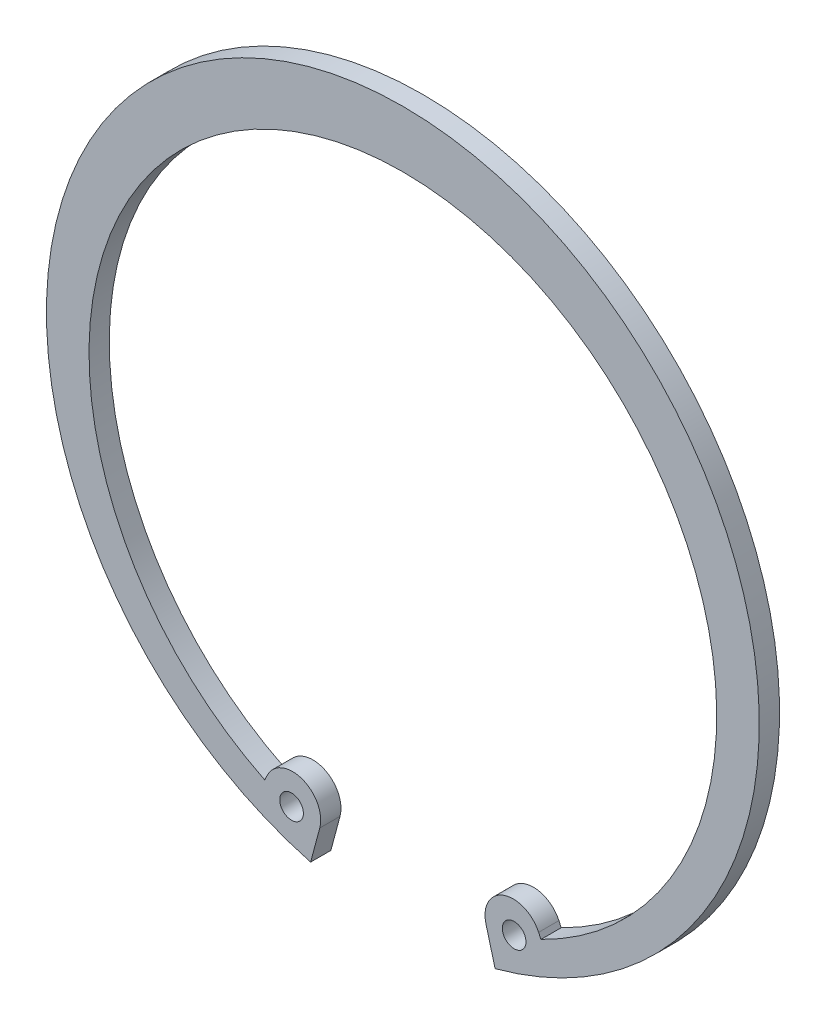
ISO-10303-21;
HEADER;
FILE_DESCRIPTION(('STEP AP214'),'2;1');
FILE_NAME('part.step','',(''),(''),'','','');
FILE_SCHEMA(('AUTOMOTIVE_DESIGN { 1 0 10303 214 1 1 1 1 }'));
ENDSEC;
DATA;
#1=APPLICATION_CONTEXT('core data for automotive mechanical design processes');
#2=APPLICATION_PROTOCOL_DEFINITION('international standard','automotive_design',2000,#1);
#3=PRODUCT_CONTEXT('',#1,'mechanical');
#4=PRODUCT('Part','Part','',(#3));
#5=PRODUCT_RELATED_PRODUCT_CATEGORY('part','',(#4));
#6=PRODUCT_DEFINITION_FORMATION('','',#4);
#7=PRODUCT_DEFINITION_CONTEXT('part definition',#1,'design');
#8=PRODUCT_DEFINITION('design','',#6,#7);
#9=PRODUCT_DEFINITION_SHAPE('','',#8);
#10=(LENGTH_UNIT() NAMED_UNIT(*) SI_UNIT(.MILLI.,.METRE.));
#11=(NAMED_UNIT(*) PLANE_ANGLE_UNIT() SI_UNIT($,.RADIAN.));
#12=(NAMED_UNIT(*) SI_UNIT($,.STERADIAN.) SOLID_ANGLE_UNIT());
#13=UNCERTAINTY_MEASURE_WITH_UNIT(LENGTH_MEASURE(1.E-05),#10,'distance_accuracy_value','');
#14=(GEOMETRIC_REPRESENTATION_CONTEXT(3) GLOBAL_UNCERTAINTY_ASSIGNED_CONTEXT((#13)) GLOBAL_UNIT_ASSIGNED_CONTEXT((#10,
#11,#12)) REPRESENTATION_CONTEXT('',''));
#15=CARTESIAN_POINT('',(0.,0.,0.));
#16=DIRECTION('',(0.,0.,1.));
#17=DIRECTION('',(1.,0.,0.));
#18=AXIS2_PLACEMENT_3D('',#15,#16,#17);
#19=CARTESIAN_POINT('',(16.3201281160182,-44.8324552460225,0.));
#20=DIRECTION('',(0.,0.,-1.));
#21=DIRECTION('',(-1.,0.,0.));
#22=AXIS2_PLACEMENT_3D('',#19,#20,#21);
#23=CYLINDRICAL_SURFACE('',#22,4.16053997923156);
#24=DIRECTION('',(0.,0.,-1.));
#25=VECTOR('',#24,1.);
#26=CARTESIAN_POINT('',(20.0906882640602,-43.0737713378737,3.));
#27=LINE('',#26,#25);
#28=CARTESIAN_POINT('',(20.0906882640602,-43.0737713378737,0.));
#29=VERTEX_POINT('',#28);
#30=CARTESIAN_POINT('',(20.0906882640602,-43.0737713378737,3.));
#31=VERTEX_POINT('',#30);
#32=EDGE_CURVE('E169',#29,#31,#27,.F.);
#33=ORIENTED_EDGE('',*,*,#32,.F.);
#34=CARTESIAN_POINT('',(16.3201281160182,-44.8324552460225,0.));
#35=DIRECTION('',(0.,0.,1.));
#36=DIRECTION('',(1.,0.,0.));
#37=AXIS2_PLACEMENT_3D('',#34,#35,#36);
#38=CIRCLE('',#37,4.16053997923156);
#39=CARTESIAN_POINT('',(12.3013550987702,-45.909282230558,0.));
#40=VERTEX_POINT('',#39);
#41=EDGE_CURVE('E43',#40,#29,#38,.F.);
#42=ORIENTED_EDGE('',*,*,#41,.F.);
#43=DIRECTION('',(0.,0.,-1.));
#44=VECTOR('',#43,1.);
#45=CARTESIAN_POINT('',(12.3013550987702,-45.909282230558,3.));
#46=LINE('',#45,#44);
#47=CARTESIAN_POINT('',(12.3013550987702,-45.909282230558,3.));
#48=VERTEX_POINT('',#47);
#49=EDGE_CURVE('E172',#48,#40,#46,.T.);
#50=ORIENTED_EDGE('',*,*,#49,.F.);
#51=CARTESIAN_POINT('',(16.3201281160182,-44.8324552460225,3.));
#52=DIRECTION('',(0.,0.,1.));
#53=DIRECTION('',(1.,0.,0.));
#54=AXIS2_PLACEMENT_3D('',#51,#52,#53);
#55=CIRCLE('',#54,4.16053997923156);
#56=EDGE_CURVE('E11',#31,#48,#55,.T.);
#57=ORIENTED_EDGE('',*,*,#56,.F.);
#58=EDGE_LOOP('',(#33,#42,#50,#57));
#59=FACE_BOUND('',#58,.T.);
#60=ADVANCED_FACE('F36',(#59),#23,.T.);
#61=CARTESIAN_POINT('',(0.,-2.1,3.));
#62=DIRECTION('',(0.,0.,1.));
#63=DIRECTION('',(1.,0.,0.));
#64=AXIS2_PLACEMENT_3D('',#61,#62,#63);
#65=PLANE('',#64);
#66=DIRECTION('',(-0.422705686504093,0.906267015066257,0.));
#67=VECTOR('',#66,1.);
#68=CARTESIAN_POINT('',(18.4792293971957,-39.6188568103371,3.));
#69=LINE('',#68,#67);
#70=CARTESIAN_POINT('',(20.435570278157,-43.8131869725451,3.));
#71=VERTEX_POINT('',#70);
#72=EDGE_CURVE('E156',#71,#31,#69,.T.);
#73=ORIENTED_EDGE('',*,*,#72,.T.);
#74=ORIENTED_EDGE('',*,*,#56,.T.);
#75=DIRECTION('',(0.258819045102514,-0.96592582628907,0.));
#76=VECTOR('',#75,1.);
#77=CARTESIAN_POINT('',(11.3146727368811,-42.2269335250555,3.));
#78=LINE('',#77,#76);
#79=CARTESIAN_POINT('',(13.6527046291576,-50.9525873367484,3.));
#80=VERTEX_POINT('',#79);
#81=EDGE_CURVE('E104',#48,#80,#78,.T.);
#82=ORIENTED_EDGE('',*,*,#81,.T.);
#83=CARTESIAN_POINT('',(0.,0.,3.));
#84=DIRECTION('',(0.,0.,1.));
#85=DIRECTION('',(1.,0.,0.));
#86=AXIS2_PLACEMENT_3D('',#83,#84,#85);
#87=CIRCLE('',#86,52.75);
#88=CARTESIAN_POINT('',(-13.6527046291576,-50.9525873367484,3.));
#89=VERTEX_POINT('',#88);
#90=EDGE_CURVE('E95',#80,#89,#87,.T.);
#91=ORIENTED_EDGE('',*,*,#90,.T.);
#92=DIRECTION('',(-0.258819045102514,-0.96592582628907,0.));
#93=VECTOR('',#92,1.);
#94=CARTESIAN_POINT('',(-11.314672736881,-42.2269335250555,3.));
#95=LINE('',#94,#93);
#96=CARTESIAN_POINT('',(-12.3013550987702,-45.909282230558,3.));
#97=VERTEX_POINT('',#96);
#98=EDGE_CURVE('E101',#97,#89,#95,.T.);
#99=ORIENTED_EDGE('',*,*,#98,.F.);
#100=CARTESIAN_POINT('',(-16.3201281160181,-44.8324552460225,3.));
#101=DIRECTION('',(0.,0.,-1.));
#102=DIRECTION('',(-1.,0.,0.));
#103=AXIS2_PLACEMENT_3D('',#100,#101,#102);
#104=CIRCLE('',#103,4.16053997923156);
#105=CARTESIAN_POINT('',(-20.0906882640602,-43.0737713378737,3.));
#106=VERTEX_POINT('',#105);
#107=EDGE_CURVE('E144',#106,#97,#104,.T.);
#108=ORIENTED_EDGE('',*,*,#107,.F.);
#109=DIRECTION('',(0.422705686504092,0.906267015066257,0.));
#110=VECTOR('',#109,1.);
#111=CARTESIAN_POINT('',(-18.4792293971957,-39.6188568103371,3.));
#112=LINE('',#111,#110);
#113=CARTESIAN_POINT('',(-20.435570278157,-43.8131869725451,3.));
#114=VERTEX_POINT('',#113);
#115=EDGE_CURVE('E124',#114,#106,#112,.T.);
#116=ORIENTED_EDGE('',*,*,#115,.F.);
#117=CARTESIAN_POINT('',(0.,-2.1,3.));
#118=DIRECTION('',(0.,0.,-1.));
#119=DIRECTION('',(1.,0.,0.));
#120=AXIS2_PLACEMENT_3D('',#117,#118,#119);
#121=CIRCLE('',#120,46.45);
#122=EDGE_CURVE('E108',#114,#71,#121,.T.);
#123=ORIENTED_EDGE('',*,*,#122,.T.);
#124=EDGE_LOOP('',(#73,#74,#82,#91,#99,#108,#116,#123));
#125=FACE_BOUND('',#124,.T.);
#126=CARTESIAN_POINT('',(16.4704522130401,-45.2454053346631,3.));
#127=DIRECTION('',(0.,0.,1.));
#128=DIRECTION('',(1.,0.,0.));
#129=AXIS2_PLACEMENT_3D('',#126,#127,#128);
#130=CIRCLE('',#129,1.75);
#131=CARTESIAN_POINT('',(18.2204522130401,-45.2454053346631,3.));
#132=VERTEX_POINT('',#131);
#133=EDGE_CURVE('E147',#132,#132,#130,.T.);
#134=ORIENTED_EDGE('',*,*,#133,.F.);
#135=EDGE_LOOP('',(#134));
#136=FACE_BOUND('',#135,.T.);
#137=CARTESIAN_POINT('',(-16.4704522130401,-45.2454053346631,3.));
#138=DIRECTION('',(0.,0.,-1.));
#139=DIRECTION('',(-1.,0.,0.));
#140=AXIS2_PLACEMENT_3D('',#137,#138,#139);
#141=CIRCLE('',#140,1.75);
#142=CARTESIAN_POINT('',(-18.2204522130401,-45.2454053346631,3.));
#143=VERTEX_POINT('',#142);
#144=EDGE_CURVE('E134',#143,#143,#141,.T.);
#145=ORIENTED_EDGE('',*,*,#144,.T.);
#146=EDGE_LOOP('',(#145));
#147=FACE_BOUND('',#146,.T.);
#148=ADVANCED_FACE('F97',(#125,#136,#147),#65,.T.);
#149=CARTESIAN_POINT('',(0.,-2.1,0.));
#150=DIRECTION('',(0.,0.,1.));
#151=DIRECTION('',(1.,0.,0.));
#152=AXIS2_PLACEMENT_3D('',#149,#150,#151);
#153=PLANE('',#152);
#154=DIRECTION('',(0.258819045102514,-0.96592582628907,0.));
#155=VECTOR('',#154,1.);
#156=CARTESIAN_POINT('',(11.3146727368811,-42.2269335250555,0.));
#157=LINE('',#156,#155);
#158=CARTESIAN_POINT('',(13.6527046291576,-50.9525873367484,0.));
#159=VERTEX_POINT('',#158);
#160=EDGE_CURVE('E150',#40,#159,#157,.T.);
#161=ORIENTED_EDGE('',*,*,#160,.F.);
#162=ORIENTED_EDGE('',*,*,#41,.T.);
#163=DIRECTION('',(-0.422705686504093,0.906267015066257,0.));
#164=VECTOR('',#163,1.);
#165=CARTESIAN_POINT('',(18.4792293971957,-39.6188568103371,0.));
#166=LINE('',#165,#164);
#167=CARTESIAN_POINT('',(20.435570278157,-43.8131869725451,0.));
#168=VERTEX_POINT('',#167);
#169=EDGE_CURVE('E153',#168,#29,#166,.T.);
#170=ORIENTED_EDGE('',*,*,#169,.F.);
#171=CARTESIAN_POINT('',(0.,-2.1,0.));
#172=DIRECTION('',(0.,0.,-1.));
#173=DIRECTION('',(1.,0.,0.));
#174=AXIS2_PLACEMENT_3D('',#171,#172,#173);
#175=CIRCLE('',#174,46.45);
#176=CARTESIAN_POINT('',(-20.435570278157,-43.8131869725451,0.));
#177=VERTEX_POINT('',#176);
#178=EDGE_CURVE('E161',#177,#168,#175,.T.);
#179=ORIENTED_EDGE('',*,*,#178,.F.);
#180=DIRECTION('',(0.422705686504092,0.906267015066257,0.));
#181=VECTOR('',#180,1.);
#182=CARTESIAN_POINT('',(-18.4792293971957,-39.6188568103371,0.));
#183=LINE('',#182,#181);
#184=CARTESIAN_POINT('',(-20.0906882640602,-43.0737713378737,0.));
#185=VERTEX_POINT('',#184);
#186=EDGE_CURVE('E125',#177,#185,#183,.T.);
#187=ORIENTED_EDGE('',*,*,#186,.T.);
#188=CARTESIAN_POINT('',(-16.3201281160181,-44.8324552460225,0.));
#189=DIRECTION('',(0.,0.,-1.));
#190=DIRECTION('',(-1.,0.,0.));
#191=AXIS2_PLACEMENT_3D('',#188,#189,#190);
#192=CIRCLE('',#191,4.16053997923156);
#193=CARTESIAN_POINT('',(-12.3013550987702,-45.909282230558,0.));
#194=VERTEX_POINT('',#193);
#195=EDGE_CURVE('E141',#194,#185,#192,.F.);
#196=ORIENTED_EDGE('',*,*,#195,.F.);
#197=DIRECTION('',(-0.258819045102514,-0.96592582628907,0.));
#198=VECTOR('',#197,1.);
#199=CARTESIAN_POINT('',(-11.314672736881,-42.2269335250555,0.));
#200=LINE('',#199,#198);
#201=CARTESIAN_POINT('',(-13.6527046291576,-50.9525873367484,0.));
#202=VERTEX_POINT('',#201);
#203=EDGE_CURVE('E128',#194,#202,#200,.T.);
#204=ORIENTED_EDGE('',*,*,#203,.T.);
#205=CARTESIAN_POINT('',(0.,0.,0.));
#206=DIRECTION('',(0.,0.,1.));
#207=DIRECTION('',(1.,0.,0.));
#208=AXIS2_PLACEMENT_3D('',#205,#206,#207);
#209=CIRCLE('',#208,52.75);
#210=EDGE_CURVE('E114',#159,#202,#209,.T.);
#211=ORIENTED_EDGE('',*,*,#210,.F.);
#212=EDGE_LOOP('',(#161,#162,#170,#179,#187,#196,#204,#211));
#213=FACE_BOUND('',#212,.T.);
#214=CARTESIAN_POINT('',(16.4704522130401,-45.2454053346631,0.));
#215=DIRECTION('',(0.,0.,1.));
#216=DIRECTION('',(1.,0.,0.));
#217=AXIS2_PLACEMENT_3D('',#214,#215,#216);
#218=CIRCLE('',#217,1.75);
#219=CARTESIAN_POINT('',(18.2204522130401,-45.2454053346631,0.));
#220=VERTEX_POINT('',#219);
#221=EDGE_CURVE('E146',#220,#220,#218,.T.);
#222=ORIENTED_EDGE('',*,*,#221,.T.);
#223=EDGE_LOOP('',(#222));
#224=FACE_BOUND('',#223,.T.);
#225=CARTESIAN_POINT('',(-16.4704522130401,-45.2454053346631,0.));
#226=DIRECTION('',(0.,0.,-1.));
#227=DIRECTION('',(-1.,0.,0.));
#228=AXIS2_PLACEMENT_3D('',#225,#226,#227);
#229=CIRCLE('',#228,1.75);
#230=CARTESIAN_POINT('',(-18.2204522130401,-45.2454053346631,0.));
#231=VERTEX_POINT('',#230);
#232=EDGE_CURVE('E131',#231,#231,#229,.T.);
#233=ORIENTED_EDGE('',*,*,#232,.F.);
#234=EDGE_LOOP('',(#233));
#235=FACE_BOUND('',#234,.T.);
#236=ADVANCED_FACE('F176',(#213,#224,#235),#153,.F.);
#237=CARTESIAN_POINT('',(11.3146727368811,-42.2269335250555,3.));
#238=DIRECTION('',(0.96592582628907,0.258819045102514,0.));
#239=DIRECTION('',(-0.258819045102514,0.96592582628907,0.));
#240=AXIS2_PLACEMENT_3D('',#237,#238,#239);
#241=PLANE('',#240);
#242=ORIENTED_EDGE('',*,*,#81,.F.);
#243=ORIENTED_EDGE('',*,*,#49,.T.);
#244=ORIENTED_EDGE('',*,*,#160,.T.);
#245=DIRECTION('',(0.,0.,-1.));
#246=VECTOR('',#245,1.);
#247=CARTESIAN_POINT('',(13.6527046291576,-50.9525873367484,3.));
#248=LINE('',#247,#246);
#249=EDGE_CURVE('E167',#80,#159,#248,.T.);
#250=ORIENTED_EDGE('',*,*,#249,.F.);
#251=EDGE_LOOP('',(#242,#243,#244,#250));
#252=FACE_BOUND('',#251,.T.);
#253=ADVANCED_FACE('F211',(#252),#241,.F.);
#254=CARTESIAN_POINT('',(0.,0.,3.));
#255=DIRECTION('',(0.,0.,-1.));
#256=DIRECTION('',(-1.,0.,0.));
#257=AXIS2_PLACEMENT_3D('',#254,#255,#256);
#258=CYLINDRICAL_SURFACE('',#257,52.75);
#259=ORIENTED_EDGE('',*,*,#210,.T.);
#260=DIRECTION('',(0.,0.,-1.));
#261=VECTOR('',#260,1.);
#262=CARTESIAN_POINT('',(-13.6527046291576,-50.9525873367484,3.));
#263=LINE('',#262,#261);
#264=EDGE_CURVE('E111',#89,#202,#263,.T.);
#265=ORIENTED_EDGE('',*,*,#264,.F.);
#266=ORIENTED_EDGE('',*,*,#90,.F.);
#267=ORIENTED_EDGE('',*,*,#249,.T.);
#268=EDGE_LOOP('',(#259,#265,#266,#267));
#269=FACE_BOUND('',#268,.T.);
#270=ADVANCED_FACE('F112',(#269),#258,.T.);
#271=CARTESIAN_POINT('',(0.,-2.1,3.));
#272=DIRECTION('',(0.,0.,-1.));
#273=DIRECTION('',(-1.,0.,0.));
#274=AXIS2_PLACEMENT_3D('',#271,#272,#273);
#275=CYLINDRICAL_SURFACE('',#274,46.45);
#276=ORIENTED_EDGE('',*,*,#178,.T.);
#277=DIRECTION('',(0.,0.,-1.));
#278=VECTOR('',#277,1.);
#279=CARTESIAN_POINT('',(20.435570278157,-43.8131869725451,3.));
#280=LINE('',#279,#278);
#281=EDGE_CURVE('E158',#71,#168,#280,.T.);
#282=ORIENTED_EDGE('',*,*,#281,.F.);
#283=ORIENTED_EDGE('',*,*,#122,.F.);
#284=DIRECTION('',(0.,0.,-1.));
#285=VECTOR('',#284,1.);
#286=CARTESIAN_POINT('',(-20.435570278157,-43.8131869725451,3.));
#287=LINE('',#286,#285);
#288=EDGE_CURVE('E118',#114,#177,#287,.T.);
#289=ORIENTED_EDGE('',*,*,#288,.T.);
#290=EDGE_LOOP('',(#276,#282,#283,#289));
#291=FACE_BOUND('',#290,.T.);
#292=ADVANCED_FACE('F183',(#291),#275,.F.);
#293=CARTESIAN_POINT('',(18.4792293971957,-39.6188568103371,3.));
#294=DIRECTION('',(-0.906267015066257,-0.422705686504092,0.));
#295=DIRECTION('',(0.422705686504093,-0.906267015066257,0.));
#296=AXIS2_PLACEMENT_3D('',#293,#294,#295);
#297=PLANE('',#296);
#298=ORIENTED_EDGE('',*,*,#169,.T.);
#299=ORIENTED_EDGE('',*,*,#32,.T.);
#300=ORIENTED_EDGE('',*,*,#72,.F.);
#301=ORIENTED_EDGE('',*,*,#281,.T.);
#302=EDGE_LOOP('',(#298,#299,#300,#301));
#303=FACE_BOUND('',#302,.T.);
#304=ADVANCED_FACE('F180',(#303),#297,.F.);
#305=CARTESIAN_POINT('',(16.4704522130401,-45.2454053346631,3.));
#306=DIRECTION('',(0.,0.,-1.));
#307=DIRECTION('',(-1.,0.,0.));
#308=AXIS2_PLACEMENT_3D('',#305,#306,#307);
#309=CYLINDRICAL_SURFACE('',#308,1.75);
#310=ORIENTED_EDGE('',*,*,#133,.T.);
#311=EDGE_LOOP('',(#310));
#312=FACE_BOUND('',#311,.T.);
#313=ORIENTED_EDGE('',*,*,#221,.F.);
#314=EDGE_LOOP('',(#313));
#315=FACE_BOUND('',#314,.T.);
#316=ADVANCED_FACE('F214',(#312,#315),#309,.F.);
#317=CARTESIAN_POINT('',(-16.3201281160181,-44.8324552460225,0.));
#318=DIRECTION('',(0.,0.,-1.));
#319=DIRECTION('',(1.,0.,0.));
#320=AXIS2_PLACEMENT_3D('',#317,#318,#319);
#321=CYLINDRICAL_SURFACE('',#320,4.16053997923156);
#322=DIRECTION('',(0.,0.,-1.));
#323=VECTOR('',#322,1.);
#324=CARTESIAN_POINT('',(-20.0906882640602,-43.0737713378737,3.));
#325=LINE('',#324,#323);
#326=EDGE_CURVE('E117',#185,#106,#325,.F.);
#327=ORIENTED_EDGE('',*,*,#326,.T.);
#328=ORIENTED_EDGE('',*,*,#107,.T.);
#329=DIRECTION('',(0.,0.,-1.));
#330=VECTOR('',#329,1.);
#331=CARTESIAN_POINT('',(-12.3013550987702,-45.909282230558,3.));
#332=LINE('',#331,#330);
#333=EDGE_CURVE('E122',#97,#194,#332,.T.);
#334=ORIENTED_EDGE('',*,*,#333,.T.);
#335=ORIENTED_EDGE('',*,*,#195,.T.);
#336=EDGE_LOOP('',(#327,#328,#334,#335));
#337=FACE_BOUND('',#336,.T.);
#338=ADVANCED_FACE('F190',(#337),#321,.T.);
#339=CARTESIAN_POINT('',(-11.314672736881,-42.2269335250555,3.));
#340=DIRECTION('',(-0.96592582628907,0.258819045102514,0.));
#341=DIRECTION('',(0.258819045102514,0.96592582628907,0.));
#342=AXIS2_PLACEMENT_3D('',#339,#340,#341);
#343=PLANE('',#342);
#344=ORIENTED_EDGE('',*,*,#98,.T.);
#345=ORIENTED_EDGE('',*,*,#264,.T.);
#346=ORIENTED_EDGE('',*,*,#203,.F.);
#347=ORIENTED_EDGE('',*,*,#333,.F.);
#348=EDGE_LOOP('',(#344,#345,#346,#347));
#349=FACE_BOUND('',#348,.T.);
#350=ADVANCED_FACE('F120',(#349),#343,.F.);
#351=CARTESIAN_POINT('',(-18.4792293971957,-39.6188568103371,3.));
#352=DIRECTION('',(0.906267015066257,-0.422705686504092,0.));
#353=DIRECTION('',(-0.422705686504092,-0.906267015066258,0.));
#354=AXIS2_PLACEMENT_3D('',#351,#352,#353);
#355=PLANE('',#354);
#356=ORIENTED_EDGE('',*,*,#186,.F.);
#357=ORIENTED_EDGE('',*,*,#288,.F.);
#358=ORIENTED_EDGE('',*,*,#115,.T.);
#359=ORIENTED_EDGE('',*,*,#326,.F.);
#360=EDGE_LOOP('',(#356,#357,#358,#359));
#361=FACE_BOUND('',#360,.T.);
#362=ADVANCED_FACE('F191',(#361),#355,.F.);
#363=CARTESIAN_POINT('',(-16.4704522130401,-45.2454053346631,3.));
#364=DIRECTION('',(0.,0.,-1.));
#365=DIRECTION('',(1.,0.,0.));
#366=AXIS2_PLACEMENT_3D('',#363,#364,#365);
#367=CYLINDRICAL_SURFACE('',#366,1.75);
#368=ORIENTED_EDGE('',*,*,#144,.F.);
#369=EDGE_LOOP('',(#368));
#370=FACE_BOUND('',#369,.T.);
#371=ORIENTED_EDGE('',*,*,#232,.T.);
#372=EDGE_LOOP('',(#371));
#373=FACE_BOUND('',#372,.T.);
#374=ADVANCED_FACE('F194',(#370,#373),#367,.F.);
#375=CLOSED_SHELL('',(#60,#148,#236,#253,#270,#292,#304,#316,#338,#350,#362,#374));
#376=MANIFOLD_SOLID_BREP('B2',#375);
#377=ADVANCED_BREP_SHAPE_REPRESENTATION('',(#18,#376),#14);
#378=SHAPE_DEFINITION_REPRESENTATION(#9,#377);
ENDSEC;
END-ISO-10303-21;
